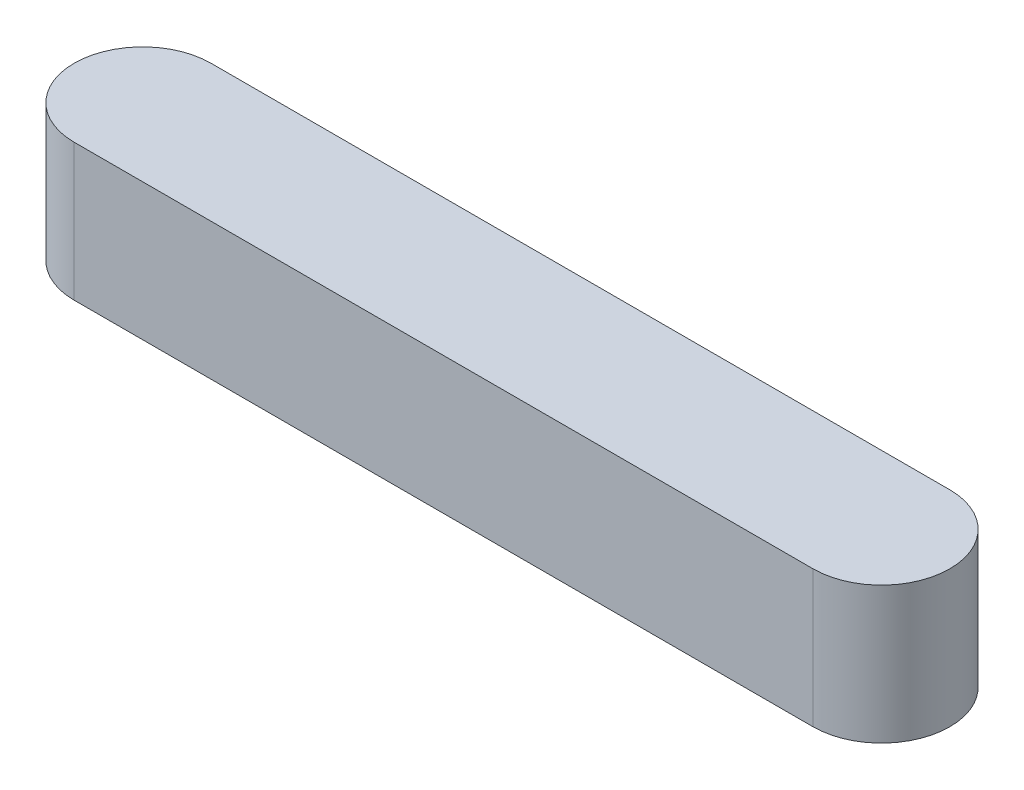
ISO-10303-21;
HEADER;
FILE_DESCRIPTION(('STEP AP214'),'2;1');
FILE_NAME('part.step','',(''),(''),'','','');
FILE_SCHEMA(('AUTOMOTIVE_DESIGN { 1 0 10303 214 1 1 1 1 }'));
ENDSEC;
DATA;
#1=APPLICATION_CONTEXT('core data for automotive mechanical design processes');
#2=APPLICATION_PROTOCOL_DEFINITION('international standard','automotive_design',2000,#1);
#3=PRODUCT_CONTEXT('',#1,'mechanical');
#4=PRODUCT('Part','Part','',(#3));
#5=PRODUCT_RELATED_PRODUCT_CATEGORY('part','',(#4));
#6=PRODUCT_DEFINITION_FORMATION('','',#4);
#7=PRODUCT_DEFINITION_CONTEXT('part definition',#1,'design');
#8=PRODUCT_DEFINITION('design','',#6,#7);
#9=PRODUCT_DEFINITION_SHAPE('','',#8);
#10=(LENGTH_UNIT() NAMED_UNIT(*) SI_UNIT(.MILLI.,.METRE.));
#11=(NAMED_UNIT(*) PLANE_ANGLE_UNIT() SI_UNIT($,.RADIAN.));
#12=(NAMED_UNIT(*) SI_UNIT($,.STERADIAN.) SOLID_ANGLE_UNIT());
#13=UNCERTAINTY_MEASURE_WITH_UNIT(LENGTH_MEASURE(1.E-05),#10,'distance_accuracy_value','');
#14=(GEOMETRIC_REPRESENTATION_CONTEXT(3) GLOBAL_UNCERTAINTY_ASSIGNED_CONTEXT((#13)) GLOBAL_UNIT_ASSIGNED_CONTEXT((#10,
#11,#12)) REPRESENTATION_CONTEXT('',''));
#15=CARTESIAN_POINT('',(0.,0.,0.));
#16=DIRECTION('',(0.,0.,1.));
#17=DIRECTION('',(1.,0.,0.));
#18=AXIS2_PLACEMENT_3D('',#15,#16,#17);
#19=CARTESIAN_POINT('',(0.,5.,0.));
#20=DIRECTION('',(0.,-1.,0.));
#21=DIRECTION('',(0.,0.,-1.));
#22=AXIS2_PLACEMENT_3D('',#19,#20,#21);
#23=CYLINDRICAL_SURFACE('',#22,2.5);
#24=CARTESIAN_POINT('',(0.,0.,0.));
#25=DIRECTION('',(0.,1.,0.));
#26=DIRECTION('',(0.,0.,1.));
#27=AXIS2_PLACEMENT_3D('',#24,#25,#26);
#28=CIRCLE('',#27,2.5);
#29=CARTESIAN_POINT('',(0.,0.,-2.5));
#30=VERTEX_POINT('',#29);
#31=CARTESIAN_POINT('',(0.,0.,2.5));
#32=VERTEX_POINT('',#31);
#33=EDGE_CURVE('E98',#30,#32,#28,.T.);
#34=ORIENTED_EDGE('',*,*,#33,.T.);
#35=DIRECTION('',(0.,-1.,0.));
#36=VECTOR('',#35,1.);
#37=CARTESIAN_POINT('',(0.,5.,2.5));
#38=LINE('',#37,#36);
#39=CARTESIAN_POINT('',(0.,5.,2.5));
#40=VERTEX_POINT('',#39);
#41=EDGE_CURVE('E11',#40,#32,#38,.T.);
#42=ORIENTED_EDGE('',*,*,#41,.F.);
#43=CARTESIAN_POINT('',(0.,5.,0.));
#44=DIRECTION('',(0.,1.,0.));
#45=DIRECTION('',(0.,0.,1.));
#46=AXIS2_PLACEMENT_3D('',#43,#44,#45);
#47=CIRCLE('',#46,2.5);
#48=CARTESIAN_POINT('',(0.,5.,-2.5));
#49=VERTEX_POINT('',#48);
#50=EDGE_CURVE('E86',#49,#40,#47,.T.);
#51=ORIENTED_EDGE('',*,*,#50,.F.);
#52=DIRECTION('',(0.,-1.,0.));
#53=VECTOR('',#52,1.);
#54=CARTESIAN_POINT('',(0.,5.,-2.5));
#55=LINE('',#54,#53);
#56=EDGE_CURVE('E94',#49,#30,#55,.T.);
#57=ORIENTED_EDGE('',*,*,#56,.T.);
#58=EDGE_LOOP('',(#34,#42,#51,#57));
#59=FACE_BOUND('',#58,.T.);
#60=ADVANCED_FACE('F35',(#59),#23,.T.);
#61=CARTESIAN_POINT('',(0.,5.,2.5));
#62=DIRECTION('',(0.,0.,-1.));
#63=DIRECTION('',(-1.,0.,0.));
#64=AXIS2_PLACEMENT_3D('',#61,#62,#63);
#65=PLANE('',#64);
#66=DIRECTION('',(1.,0.,0.));
#67=VECTOR('',#66,1.);
#68=CARTESIAN_POINT('',(0.,0.,2.5));
#69=LINE('',#68,#67);
#70=CARTESIAN_POINT('',(27.,0.,2.5));
#71=VERTEX_POINT('',#70);
#72=EDGE_CURVE('E90',#32,#71,#69,.T.);
#73=ORIENTED_EDGE('',*,*,#72,.T.);
#74=DIRECTION('',(0.,-1.,0.));
#75=VECTOR('',#74,1.);
#76=CARTESIAN_POINT('',(27.,5.,2.5));
#77=LINE('',#76,#75);
#78=CARTESIAN_POINT('',(27.,5.,2.5));
#79=VERTEX_POINT('',#78);
#80=EDGE_CURVE('E43',#79,#71,#77,.T.);
#81=ORIENTED_EDGE('',*,*,#80,.F.);
#82=DIRECTION('',(1.,0.,0.));
#83=VECTOR('',#82,1.);
#84=CARTESIAN_POINT('',(0.,5.,2.5));
#85=LINE('',#84,#83);
#86=EDGE_CURVE('E81',#40,#79,#85,.T.);
#87=ORIENTED_EDGE('',*,*,#86,.F.);
#88=ORIENTED_EDGE('',*,*,#41,.T.);
#89=EDGE_LOOP('',(#73,#81,#87,#88));
#90=FACE_BOUND('',#89,.T.);
#91=ADVANCED_FACE('F89',(#90),#65,.F.);
#92=CARTESIAN_POINT('',(27.,5.,0.));
#93=DIRECTION('',(0.,-1.,0.));
#94=DIRECTION('',(0.,0.,-1.));
#95=AXIS2_PLACEMENT_3D('',#92,#93,#94);
#96=CYLINDRICAL_SURFACE('',#95,2.5);
#97=CARTESIAN_POINT('',(27.,0.,0.));
#98=DIRECTION('',(0.,1.,0.));
#99=DIRECTION('',(0.,0.,1.));
#100=AXIS2_PLACEMENT_3D('',#97,#98,#99);
#101=CIRCLE('',#100,2.5);
#102=CARTESIAN_POINT('',(27.,0.,-2.5));
#103=VERTEX_POINT('',#102);
#104=EDGE_CURVE('E68',#71,#103,#101,.T.);
#105=ORIENTED_EDGE('',*,*,#104,.T.);
#106=DIRECTION('',(0.,-1.,0.));
#107=VECTOR('',#106,1.);
#108=CARTESIAN_POINT('',(27.,5.,-2.5));
#109=LINE('',#108,#107);
#110=CARTESIAN_POINT('',(27.,5.,-2.5));
#111=VERTEX_POINT('',#110);
#112=EDGE_CURVE('E91',#111,#103,#109,.T.);
#113=ORIENTED_EDGE('',*,*,#112,.F.);
#114=CARTESIAN_POINT('',(27.,5.,0.));
#115=DIRECTION('',(0.,1.,0.));
#116=DIRECTION('',(0.,0.,1.));
#117=AXIS2_PLACEMENT_3D('',#114,#115,#116);
#118=CIRCLE('',#117,2.5);
#119=EDGE_CURVE('E84',#79,#111,#118,.T.);
#120=ORIENTED_EDGE('',*,*,#119,.F.);
#121=ORIENTED_EDGE('',*,*,#80,.T.);
#122=EDGE_LOOP('',(#105,#113,#120,#121));
#123=FACE_BOUND('',#122,.T.);
#124=ADVANCED_FACE('F92',(#123),#96,.T.);
#125=CARTESIAN_POINT('',(0.,5.,-2.5));
#126=DIRECTION('',(0.,0.,1.));
#127=DIRECTION('',(1.,0.,0.));
#128=AXIS2_PLACEMENT_3D('',#125,#126,#127);
#129=PLANE('',#128);
#130=DIRECTION('',(-1.,0.,0.));
#131=VECTOR('',#130,1.);
#132=CARTESIAN_POINT('',(0.,0.,-2.5));
#133=LINE('',#132,#131);
#134=EDGE_CURVE('E74',#103,#30,#133,.T.);
#135=ORIENTED_EDGE('',*,*,#134,.T.);
#136=ORIENTED_EDGE('',*,*,#56,.F.);
#137=DIRECTION('',(-1.,0.,0.));
#138=VECTOR('',#137,1.);
#139=CARTESIAN_POINT('',(0.,5.,-2.5));
#140=LINE('',#139,#138);
#141=EDGE_CURVE('E51',#111,#49,#140,.T.);
#142=ORIENTED_EDGE('',*,*,#141,.F.);
#143=ORIENTED_EDGE('',*,*,#112,.T.);
#144=EDGE_LOOP('',(#135,#136,#142,#143));
#145=FACE_BOUND('',#144,.T.);
#146=ADVANCED_FACE('F105',(#145),#129,.F.);
#147=CARTESIAN_POINT('',(0.,5.,0.));
#148=DIRECTION('',(0.,1.,0.));
#149=DIRECTION('',(0.,0.,1.));
#150=AXIS2_PLACEMENT_3D('',#147,#148,#149);
#151=PLANE('',#150);
#152=ORIENTED_EDGE('',*,*,#50,.T.);
#153=ORIENTED_EDGE('',*,*,#86,.T.);
#154=ORIENTED_EDGE('',*,*,#119,.T.);
#155=ORIENTED_EDGE('',*,*,#141,.T.);
#156=EDGE_LOOP('',(#152,#153,#154,#155));
#157=FACE_BOUND('',#156,.T.);
#158=ADVANCED_FACE('F82',(#157),#151,.T.);
#159=CARTESIAN_POINT('',(0.,0.,0.));
#160=DIRECTION('',(0.,1.,0.));
#161=DIRECTION('',(0.,0.,1.));
#162=AXIS2_PLACEMENT_3D('',#159,#160,#161);
#163=PLANE('',#162);
#164=ORIENTED_EDGE('',*,*,#33,.F.);
#165=ORIENTED_EDGE('',*,*,#134,.F.);
#166=ORIENTED_EDGE('',*,*,#104,.F.);
#167=ORIENTED_EDGE('',*,*,#72,.F.);
#168=EDGE_LOOP('',(#164,#165,#166,#167));
#169=FACE_BOUND('',#168,.T.);
#170=ADVANCED_FACE('F108',(#169),#163,.F.);
#171=CLOSED_SHELL('',(#60,#91,#124,#146,#158,#170));
#172=MANIFOLD_SOLID_BREP('B2',#171);
#173=ADVANCED_BREP_SHAPE_REPRESENTATION('',(#18,#172),#14);
#174=SHAPE_DEFINITION_REPRESENTATION(#9,#173);
ENDSEC;
END-ISO-10303-21;
